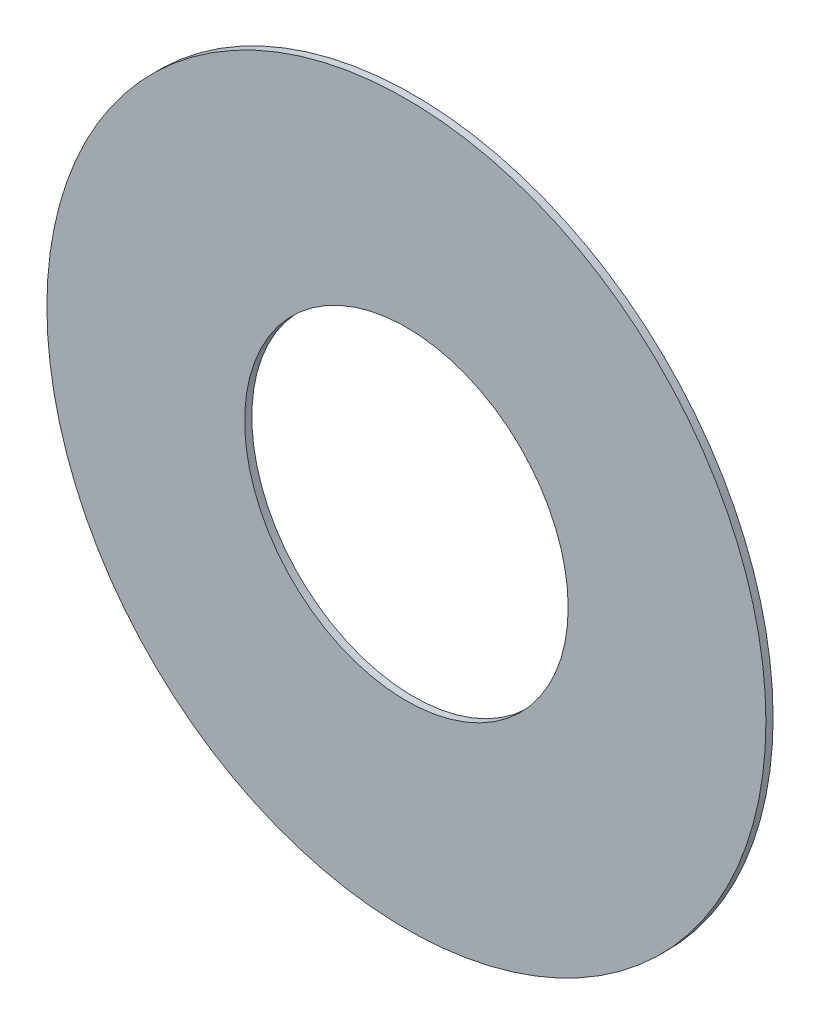
ISO-10303-21;
HEADER;
FILE_DESCRIPTION(('STEP AP214'),'2;1');
FILE_NAME('part.step','',(''),(''),'','','');
FILE_SCHEMA(('AUTOMOTIVE_DESIGN { 1 0 10303 214 1 1 1 1 }'));
ENDSEC;
DATA;
#1=APPLICATION_CONTEXT('core data for automotive mechanical design processes');
#2=APPLICATION_PROTOCOL_DEFINITION('international standard','automotive_design',2000,#1);
#3=PRODUCT_CONTEXT('',#1,'mechanical');
#4=PRODUCT('Part','Part','',(#3));
#5=PRODUCT_RELATED_PRODUCT_CATEGORY('part','',(#4));
#6=PRODUCT_DEFINITION_FORMATION('','',#4);
#7=PRODUCT_DEFINITION_CONTEXT('part definition',#1,'design');
#8=PRODUCT_DEFINITION('design','',#6,#7);
#9=PRODUCT_DEFINITION_SHAPE('','',#8);
#10=(LENGTH_UNIT() NAMED_UNIT(*) SI_UNIT(.MILLI.,.METRE.));
#11=(NAMED_UNIT(*) PLANE_ANGLE_UNIT() SI_UNIT($,.RADIAN.));
#12=(NAMED_UNIT(*) SI_UNIT($,.STERADIAN.) SOLID_ANGLE_UNIT());
#13=UNCERTAINTY_MEASURE_WITH_UNIT(LENGTH_MEASURE(1.E-05),#10,'distance_accuracy_value','');
#14=(GEOMETRIC_REPRESENTATION_CONTEXT(3) GLOBAL_UNCERTAINTY_ASSIGNED_CONTEXT((#13)) GLOBAL_UNIT_ASSIGNED_CONTEXT((#10,
#11,#12)) REPRESENTATION_CONTEXT('',''));
#15=CARTESIAN_POINT('',(0.,0.,0.));
#16=DIRECTION('',(0.,0.,1.));
#17=DIRECTION('',(1.,0.,0.));
#18=AXIS2_PLACEMENT_3D('',#15,#16,#17);
#19=CARTESIAN_POINT('',(0.,0.,0.24));
#20=DIRECTION('',(0.,0.,-1.));
#21=DIRECTION('',(-1.,0.,0.));
#22=AXIS2_PLACEMENT_3D('',#19,#20,#21);
#23=CYLINDRICAL_SURFACE('',#22,12.);
#24=CARTESIAN_POINT('',(0.,0.,0.24));
#25=DIRECTION('',(0.,0.,1.));
#26=DIRECTION('',(1.,0.,0.));
#27=AXIS2_PLACEMENT_3D('',#24,#25,#26);
#28=CIRCLE('',#27,12.);
#29=CARTESIAN_POINT('',(12.,0.,0.24));
#30=VERTEX_POINT('',#29);
#31=EDGE_CURVE('E10',#30,#30,#28,.T.);
#32=ORIENTED_EDGE('',*,*,#31,.F.);
#33=EDGE_LOOP('',(#32));
#34=FACE_BOUND('',#33,.T.);
#35=CARTESIAN_POINT('',(0.,0.,0.));
#36=DIRECTION('',(0.,0.,1.));
#37=DIRECTION('',(1.,0.,0.));
#38=AXIS2_PLACEMENT_3D('',#35,#36,#37);
#39=CIRCLE('',#38,12.);
#40=CARTESIAN_POINT('',(12.,0.,0.));
#41=VERTEX_POINT('',#40);
#42=EDGE_CURVE('E34',#41,#41,#39,.T.);
#43=ORIENTED_EDGE('',*,*,#42,.T.);
#44=EDGE_LOOP('',(#43));
#45=FACE_BOUND('',#44,.T.);
#46=ADVANCED_FACE('F31',(#34,#45),#23,.T.);
#47=CARTESIAN_POINT('',(0.,0.,0.24));
#48=DIRECTION('',(0.,0.,1.));
#49=DIRECTION('',(1.,0.,0.));
#50=AXIS2_PLACEMENT_3D('',#47,#48,#49);
#51=PLANE('',#50);
#52=CARTESIAN_POINT('',(0.,0.,0.239999999999997));
#53=DIRECTION('',(0.,0.,1.));
#54=DIRECTION('',(1.,0.,0.));
#55=AXIS2_PLACEMENT_3D('',#52,#53,#54);
#56=CIRCLE('',#55,5.4);
#57=CARTESIAN_POINT('',(5.4,0.,0.239999999999997));
#58=VERTEX_POINT('',#57);
#59=EDGE_CURVE('E41',#58,#58,#56,.F.);
#60=ORIENTED_EDGE('',*,*,#59,.T.);
#61=EDGE_LOOP('',(#60));
#62=FACE_BOUND('',#61,.T.);
#63=ORIENTED_EDGE('',*,*,#31,.T.);
#64=EDGE_LOOP('',(#63));
#65=FACE_BOUND('',#64,.T.);
#66=ADVANCED_FACE('F59',(#62,#65),#51,.T.);
#67=CARTESIAN_POINT('',(0.,0.,0.));
#68=DIRECTION('',(0.,0.,1.));
#69=DIRECTION('',(1.,0.,0.));
#70=AXIS2_PLACEMENT_3D('',#67,#68,#69);
#71=PLANE('',#70);
#72=CARTESIAN_POINT('',(0.,0.,0.));
#73=DIRECTION('',(0.,0.,1.));
#74=DIRECTION('',(1.,0.,0.));
#75=AXIS2_PLACEMENT_3D('',#72,#73,#74);
#76=CIRCLE('',#75,5.4);
#77=CARTESIAN_POINT('',(5.4,0.,0.));
#78=VERTEX_POINT('',#77);
#79=EDGE_CURVE('E45',#78,#78,#76,.T.);
#80=ORIENTED_EDGE('',*,*,#79,.T.);
#81=EDGE_LOOP('',(#80));
#82=FACE_BOUND('',#81,.T.);
#83=ORIENTED_EDGE('',*,*,#42,.F.);
#84=EDGE_LOOP('',(#83));
#85=FACE_BOUND('',#84,.T.);
#86=ADVANCED_FACE('F49',(#82,#85),#71,.F.);
#87=CARTESIAN_POINT('',(0.,0.,44.));
#88=DIRECTION('',(0.,0.,-1.));
#89=DIRECTION('',(-1.,0.,0.));
#90=AXIS2_PLACEMENT_3D('',#87,#88,#89);
#91=CYLINDRICAL_SURFACE('',#90,5.4);
#92=ORIENTED_EDGE('',*,*,#59,.F.);
#93=EDGE_LOOP('',(#92));
#94=FACE_BOUND('',#93,.T.);
#95=ORIENTED_EDGE('',*,*,#79,.F.);
#96=EDGE_LOOP('',(#95));
#97=FACE_BOUND('',#96,.T.);
#98=ADVANCED_FACE('F52',(#94,#97),#91,.F.);
#99=CLOSED_SHELL('',(#46,#66,#86,#98));
#100=MANIFOLD_SOLID_BREP('B2',#99);
#101=ADVANCED_BREP_SHAPE_REPRESENTATION('',(#18,#100),#14);
#102=SHAPE_DEFINITION_REPRESENTATION(#9,#101);
ENDSEC;
END-ISO-10303-21;
